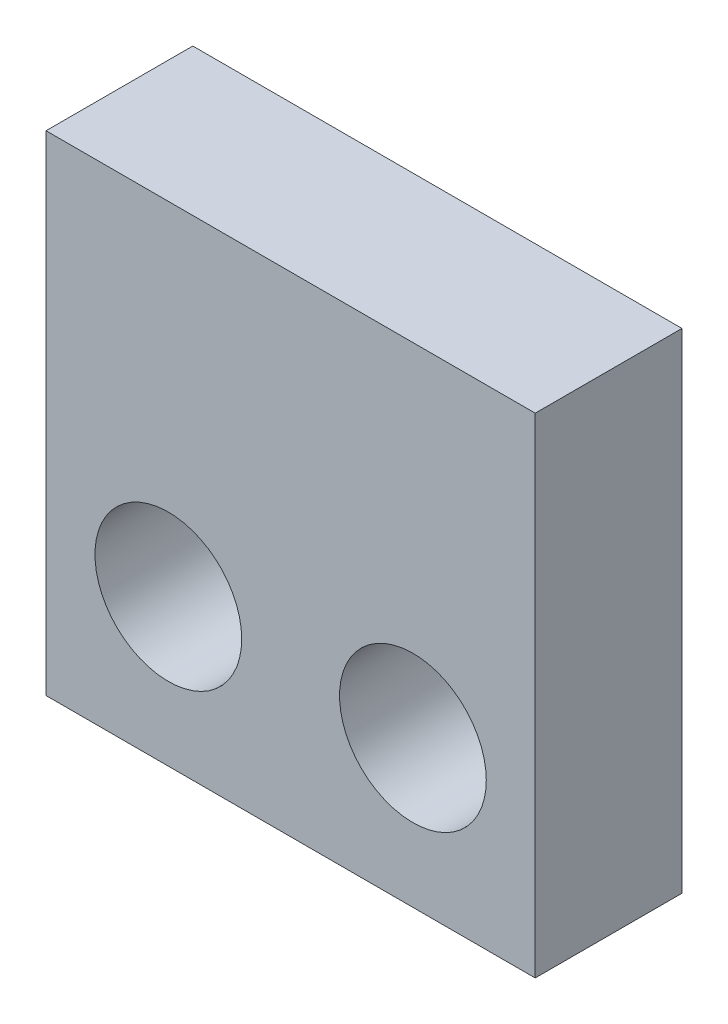
ISO-10303-21;
HEADER;
FILE_DESCRIPTION(('STEP AP214'),'2;1');
FILE_NAME('part.step','',(''),(''),'','','');
FILE_SCHEMA(('AUTOMOTIVE_DESIGN { 1 0 10303 214 1 1 1 1 }'));
ENDSEC;
DATA;
#1=APPLICATION_CONTEXT('core data for automotive mechanical design processes');
#2=APPLICATION_PROTOCOL_DEFINITION('international standard','automotive_design',2000,#1);
#3=PRODUCT_CONTEXT('',#1,'mechanical');
#4=PRODUCT('Part','Part','',(#3));
#5=PRODUCT_RELATED_PRODUCT_CATEGORY('part','',(#4));
#6=PRODUCT_DEFINITION_FORMATION('','',#4);
#7=PRODUCT_DEFINITION_CONTEXT('part definition',#1,'design');
#8=PRODUCT_DEFINITION('design','',#6,#7);
#9=PRODUCT_DEFINITION_SHAPE('','',#8);
#10=(LENGTH_UNIT() NAMED_UNIT(*) SI_UNIT(.MILLI.,.METRE.));
#11=(NAMED_UNIT(*) PLANE_ANGLE_UNIT() SI_UNIT($,.RADIAN.));
#12=(NAMED_UNIT(*) SI_UNIT($,.STERADIAN.) SOLID_ANGLE_UNIT());
#13=UNCERTAINTY_MEASURE_WITH_UNIT(LENGTH_MEASURE(1.E-05),#10,'distance_accuracy_value','');
#14=(GEOMETRIC_REPRESENTATION_CONTEXT(3) GLOBAL_UNCERTAINTY_ASSIGNED_CONTEXT((#13)) GLOBAL_UNIT_ASSIGNED_CONTEXT((#10,
#11,#12)) REPRESENTATION_CONTEXT('',''));
#15=CARTESIAN_POINT('',(0.,0.,0.));
#16=DIRECTION('',(0.,0.,1.));
#17=DIRECTION('',(1.,0.,0.));
#18=AXIS2_PLACEMENT_3D('',#15,#16,#17);
#19=CARTESIAN_POINT('',(0.,0.,3.));
#20=DIRECTION('',(0.,0.,1.));
#21=DIRECTION('',(1.,0.,0.));
#22=AXIS2_PLACEMENT_3D('',#19,#20,#21);
#23=PLANE('',#22);
#24=CARTESIAN_POINT('',(-0.0170068027210871,1.70748299319728,3.));
#25=DIRECTION('',(0.,0.,1.));
#26=DIRECTION('',(1.,0.,0.));
#27=AXIS2_PLACEMENT_3D('',#24,#25,#26);
#28=CIRCLE('',#27,1.5);
#29=CARTESIAN_POINT('',(1.48299319727891,1.70748299319728,3.));
#30=VERTEX_POINT('',#29);
#31=EDGE_CURVE('E112',#30,#30,#28,.T.);
#32=ORIENTED_EDGE('',*,*,#31,.F.);
#33=EDGE_LOOP('',(#32));
#34=FACE_BOUND('',#33,.T.);
#35=DIRECTION('',(0.,-1.,0.));
#36=VECTOR('',#35,1.);
#37=CARTESIAN_POINT('',(-2.51700680272109,8.70748299319728,3.));
#38=LINE('',#37,#36);
#39=CARTESIAN_POINT('',(-2.51700680272109,8.70748299319728,3.));
#40=VERTEX_POINT('',#39);
#41=CARTESIAN_POINT('',(-2.51700680272109,-1.29251700680272,3.));
#42=VERTEX_POINT('',#41);
#43=EDGE_CURVE('E92',#40,#42,#38,.T.);
#44=ORIENTED_EDGE('',*,*,#43,.T.);
#45=DIRECTION('',(1.,0.,0.));
#46=VECTOR('',#45,1.);
#47=CARTESIAN_POINT('',(-2.51700680272109,-1.29251700680272,3.));
#48=LINE('',#47,#46);
#49=CARTESIAN_POINT('',(7.48299319727891,-1.29251700680272,3.));
#50=VERTEX_POINT('',#49);
#51=EDGE_CURVE('E87',#42,#50,#48,.T.);
#52=ORIENTED_EDGE('',*,*,#51,.T.);
#53=DIRECTION('',(0.,1.,0.));
#54=VECTOR('',#53,1.);
#55=CARTESIAN_POINT('',(7.48299319727891,8.70748299319728,3.));
#56=LINE('',#55,#54);
#57=CARTESIAN_POINT('',(7.48299319727891,8.70748299319728,3.));
#58=VERTEX_POINT('',#57);
#59=EDGE_CURVE('E90',#50,#58,#56,.T.);
#60=ORIENTED_EDGE('',*,*,#59,.T.);
#61=DIRECTION('',(-1.,0.,0.));
#62=VECTOR('',#61,1.);
#63=CARTESIAN_POINT('',(-2.51700680272109,8.70748299319728,3.));
#64=LINE('',#63,#62);
#65=EDGE_CURVE('E57',#58,#40,#64,.T.);
#66=ORIENTED_EDGE('',*,*,#65,.T.);
#67=EDGE_LOOP('',(#44,#52,#60,#66));
#68=FACE_BOUND('',#67,.T.);
#69=CARTESIAN_POINT('',(4.98299319727891,1.70748299319728,3.));
#70=DIRECTION('',(0.,0.,1.));
#71=DIRECTION('',(1.,0.,0.));
#72=AXIS2_PLACEMENT_3D('',#69,#70,#71);
#73=CIRCLE('',#72,1.5);
#74=CARTESIAN_POINT('',(6.48299319727891,1.70748299319728,3.));
#75=VERTEX_POINT('',#74);
#76=EDGE_CURVE('E134',#75,#75,#73,.T.);
#77=ORIENTED_EDGE('',*,*,#76,.F.);
#78=EDGE_LOOP('',(#77));
#79=FACE_BOUND('',#78,.T.);
#80=ADVANCED_FACE('F39',(#34,#68,#79),#23,.T.);
#81=CARTESIAN_POINT('',(0.,0.,0.));
#82=DIRECTION('',(0.,0.,1.));
#83=DIRECTION('',(1.,0.,0.));
#84=AXIS2_PLACEMENT_3D('',#81,#82,#83);
#85=PLANE('',#84);
#86=DIRECTION('',(0.,-1.,0.));
#87=VECTOR('',#86,1.);
#88=CARTESIAN_POINT('',(-2.51700680272109,8.70748299319728,0.));
#89=LINE('',#88,#87);
#90=CARTESIAN_POINT('',(-2.51700680272109,8.70748299319728,0.));
#91=VERTEX_POINT('',#90);
#92=CARTESIAN_POINT('',(-2.51700680272109,-1.29251700680272,0.));
#93=VERTEX_POINT('',#92);
#94=EDGE_CURVE('E108',#91,#93,#89,.T.);
#95=ORIENTED_EDGE('',*,*,#94,.F.);
#96=DIRECTION('',(-1.,0.,0.));
#97=VECTOR('',#96,1.);
#98=CARTESIAN_POINT('',(-2.51700680272109,8.70748299319728,0.));
#99=LINE('',#98,#97);
#100=CARTESIAN_POINT('',(7.48299319727891,8.70748299319728,0.));
#101=VERTEX_POINT('',#100);
#102=EDGE_CURVE('E80',#101,#91,#99,.T.);
#103=ORIENTED_EDGE('',*,*,#102,.F.);
#104=DIRECTION('',(0.,1.,0.));
#105=VECTOR('',#104,1.);
#106=CARTESIAN_POINT('',(7.48299319727891,8.70748299319728,0.));
#107=LINE('',#106,#105);
#108=CARTESIAN_POINT('',(7.48299319727891,-1.29251700680272,0.));
#109=VERTEX_POINT('',#108);
#110=EDGE_CURVE('E74',#109,#101,#107,.T.);
#111=ORIENTED_EDGE('',*,*,#110,.F.);
#112=DIRECTION('',(1.,0.,0.));
#113=VECTOR('',#112,1.);
#114=CARTESIAN_POINT('',(-2.51700680272109,-1.29251700680272,0.));
#115=LINE('',#114,#113);
#116=EDGE_CURVE('E97',#93,#109,#115,.T.);
#117=ORIENTED_EDGE('',*,*,#116,.F.);
#118=EDGE_LOOP('',(#95,#103,#111,#117));
#119=FACE_BOUND('',#118,.T.);
#120=CARTESIAN_POINT('',(-0.0170068027210871,1.70748299319728,0.));
#121=DIRECTION('',(0.,0.,1.));
#122=DIRECTION('',(1.,0.,0.));
#123=AXIS2_PLACEMENT_3D('',#120,#121,#122);
#124=CIRCLE('',#123,1.5);
#125=CARTESIAN_POINT('',(1.48299319727891,1.70748299319728,0.));
#126=VERTEX_POINT('',#125);
#127=EDGE_CURVE('E130',#126,#126,#124,.T.);
#128=ORIENTED_EDGE('',*,*,#127,.T.);
#129=EDGE_LOOP('',(#128));
#130=FACE_BOUND('',#129,.T.);
#131=CARTESIAN_POINT('',(4.98299319727891,1.70748299319728,0.));
#132=DIRECTION('',(0.,0.,1.));
#133=DIRECTION('',(1.,0.,0.));
#134=AXIS2_PLACEMENT_3D('',#131,#132,#133);
#135=CIRCLE('',#134,1.5);
#136=CARTESIAN_POINT('',(6.48299319727891,1.70748299319728,0.));
#137=VERTEX_POINT('',#136);
#138=EDGE_CURVE('E138',#137,#137,#135,.T.);
#139=ORIENTED_EDGE('',*,*,#138,.T.);
#140=EDGE_LOOP('',(#139));
#141=FACE_BOUND('',#140,.T.);
#142=ADVANCED_FACE('F125',(#119,#130,#141),#85,.F.);
#143=CARTESIAN_POINT('',(-2.51700680272109,8.70748299319728,3.));
#144=DIRECTION('',(1.,0.,0.));
#145=DIRECTION('',(0.,0.,-1.));
#146=AXIS2_PLACEMENT_3D('',#143,#144,#145);
#147=PLANE('',#146);
#148=ORIENTED_EDGE('',*,*,#94,.T.);
#149=DIRECTION('',(0.,0.,-1.));
#150=VECTOR('',#149,1.);
#151=CARTESIAN_POINT('',(-2.51700680272109,-1.29251700680272,3.));
#152=LINE('',#151,#150);
#153=EDGE_CURVE('E11',#42,#93,#152,.T.);
#154=ORIENTED_EDGE('',*,*,#153,.F.);
#155=ORIENTED_EDGE('',*,*,#43,.F.);
#156=DIRECTION('',(0.,0.,-1.));
#157=VECTOR('',#156,1.);
#158=CARTESIAN_POINT('',(-2.51700680272109,8.70748299319728,3.));
#159=LINE('',#158,#157);
#160=EDGE_CURVE('E104',#40,#91,#159,.T.);
#161=ORIENTED_EDGE('',*,*,#160,.T.);
#162=EDGE_LOOP('',(#148,#154,#155,#161));
#163=FACE_BOUND('',#162,.T.);
#164=ADVANCED_FACE('F41',(#163),#147,.F.);
#165=CARTESIAN_POINT('',(-2.51700680272109,-1.29251700680272,3.));
#166=DIRECTION('',(0.,1.,0.));
#167=DIRECTION('',(-1.,0.,0.));
#168=AXIS2_PLACEMENT_3D('',#165,#166,#167);
#169=PLANE('',#168);
#170=ORIENTED_EDGE('',*,*,#116,.T.);
#171=DIRECTION('',(0.,0.,-1.));
#172=VECTOR('',#171,1.);
#173=CARTESIAN_POINT('',(7.48299319727891,-1.29251700680272,3.));
#174=LINE('',#173,#172);
#175=EDGE_CURVE('E49',#50,#109,#174,.T.);
#176=ORIENTED_EDGE('',*,*,#175,.F.);
#177=ORIENTED_EDGE('',*,*,#51,.F.);
#178=ORIENTED_EDGE('',*,*,#153,.T.);
#179=EDGE_LOOP('',(#170,#176,#177,#178));
#180=FACE_BOUND('',#179,.T.);
#181=ADVANCED_FACE('F96',(#180),#169,.F.);
#182=CARTESIAN_POINT('',(7.48299319727891,8.70748299319728,3.));
#183=DIRECTION('',(-1.,0.,0.));
#184=DIRECTION('',(0.,-1.,0.));
#185=AXIS2_PLACEMENT_3D('',#182,#183,#184);
#186=PLANE('',#185);
#187=ORIENTED_EDGE('',*,*,#110,.T.);
#188=DIRECTION('',(0.,0.,-1.));
#189=VECTOR('',#188,1.);
#190=CARTESIAN_POINT('',(7.48299319727891,8.70748299319728,3.));
#191=LINE('',#190,#189);
#192=EDGE_CURVE('E99',#58,#101,#191,.T.);
#193=ORIENTED_EDGE('',*,*,#192,.F.);
#194=ORIENTED_EDGE('',*,*,#59,.F.);
#195=ORIENTED_EDGE('',*,*,#175,.T.);
#196=EDGE_LOOP('',(#187,#193,#194,#195));
#197=FACE_BOUND('',#196,.T.);
#198=ADVANCED_FACE('F100',(#197),#186,.F.);
#199=CARTESIAN_POINT('',(-2.51700680272109,8.70748299319728,3.));
#200=DIRECTION('',(0.,-1.,0.));
#201=DIRECTION('',(0.,0.,-1.));
#202=AXIS2_PLACEMENT_3D('',#199,#200,#201);
#203=PLANE('',#202);
#204=ORIENTED_EDGE('',*,*,#102,.T.);
#205=ORIENTED_EDGE('',*,*,#160,.F.);
#206=ORIENTED_EDGE('',*,*,#65,.F.);
#207=ORIENTED_EDGE('',*,*,#192,.T.);
#208=EDGE_LOOP('',(#204,#205,#206,#207));
#209=FACE_BOUND('',#208,.T.);
#210=ADVANCED_FACE('F122',(#209),#203,.F.);
#211=CARTESIAN_POINT('',(-0.0170068027210871,1.70748299319728,3.));
#212=DIRECTION('',(0.,0.,-1.));
#213=DIRECTION('',(-1.,0.,0.));
#214=AXIS2_PLACEMENT_3D('',#211,#212,#213);
#215=CYLINDRICAL_SURFACE('',#214,1.5);
#216=ORIENTED_EDGE('',*,*,#31,.T.);
#217=EDGE_LOOP('',(#216));
#218=FACE_BOUND('',#217,.T.);
#219=ORIENTED_EDGE('',*,*,#127,.F.);
#220=EDGE_LOOP('',(#219));
#221=FACE_BOUND('',#220,.T.);
#222=ADVANCED_FACE('F157',(#218,#221),#215,.F.);
#223=CARTESIAN_POINT('',(4.98299319727891,1.70748299319728,3.));
#224=DIRECTION('',(0.,0.,-1.));
#225=DIRECTION('',(-1.,0.,0.));
#226=AXIS2_PLACEMENT_3D('',#223,#224,#225);
#227=CYLINDRICAL_SURFACE('',#226,1.5);
#228=ORIENTED_EDGE('',*,*,#76,.T.);
#229=EDGE_LOOP('',(#228));
#230=FACE_BOUND('',#229,.T.);
#231=ORIENTED_EDGE('',*,*,#138,.F.);
#232=EDGE_LOOP('',(#231));
#233=FACE_BOUND('',#232,.T.);
#234=ADVANCED_FACE('F146',(#230,#233),#227,.F.);
#235=CLOSED_SHELL('',(#80,#142,#164,#181,#198,#210,#222,#234));
#236=MANIFOLD_SOLID_BREP('B2',#235);
#237=ADVANCED_BREP_SHAPE_REPRESENTATION('',(#18,#236),#14);
#238=SHAPE_DEFINITION_REPRESENTATION(#9,#237);
ENDSEC;
END-ISO-10303-21;
